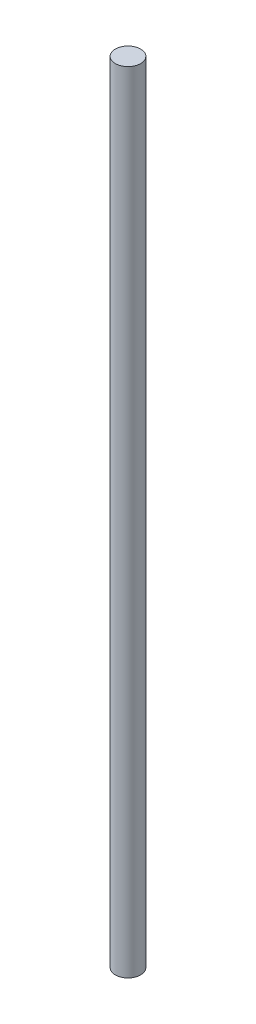
ISO-10303-21;
HEADER;
FILE_DESCRIPTION(('STEP AP214'),'2;1');
FILE_NAME('part.step','',(''),(''),'','','');
FILE_SCHEMA(('AUTOMOTIVE_DESIGN { 1 0 10303 214 1 1 1 1 }'));
ENDSEC;
DATA;
#1=APPLICATION_CONTEXT('core data for automotive mechanical design processes');
#2=APPLICATION_PROTOCOL_DEFINITION('international standard','automotive_design',2000,#1);
#3=PRODUCT_CONTEXT('',#1,'mechanical');
#4=PRODUCT('Part','Part','',(#3));
#5=PRODUCT_RELATED_PRODUCT_CATEGORY('part','',(#4));
#6=PRODUCT_DEFINITION_FORMATION('','',#4);
#7=PRODUCT_DEFINITION_CONTEXT('part definition',#1,'design');
#8=PRODUCT_DEFINITION('design','',#6,#7);
#9=PRODUCT_DEFINITION_SHAPE('','',#8);
#10=(LENGTH_UNIT() NAMED_UNIT(*) SI_UNIT(.MILLI.,.METRE.));
#11=(NAMED_UNIT(*) PLANE_ANGLE_UNIT() SI_UNIT($,.RADIAN.));
#12=(NAMED_UNIT(*) SI_UNIT($,.STERADIAN.) SOLID_ANGLE_UNIT());
#13=UNCERTAINTY_MEASURE_WITH_UNIT(LENGTH_MEASURE(1.E-05),#10,'distance_accuracy_value','');
#14=(GEOMETRIC_REPRESENTATION_CONTEXT(3) GLOBAL_UNCERTAINTY_ASSIGNED_CONTEXT((#13)) GLOBAL_UNIT_ASSIGNED_CONTEXT((#10,
#11,#12)) REPRESENTATION_CONTEXT('',''));
#15=CARTESIAN_POINT('',(0.,0.,0.));
#16=DIRECTION('',(0.,0.,1.));
#17=DIRECTION('',(1.,0.,0.));
#18=AXIS2_PLACEMENT_3D('',#15,#16,#17);
#19=CARTESIAN_POINT('',(0.,250.,0.));
#20=DIRECTION('',(0.,-1.,0.));
#21=DIRECTION('',(0.,0.,-1.));
#22=AXIS2_PLACEMENT_3D('',#19,#20,#21);
#23=CYLINDRICAL_SURFACE('',#22,4.);
#24=CARTESIAN_POINT('',(0.,250.,0.));
#25=DIRECTION('',(0.,1.,0.));
#26=DIRECTION('',(0.,0.,1.));
#27=AXIS2_PLACEMENT_3D('',#24,#25,#26);
#28=CIRCLE('',#27,4.);
#29=CARTESIAN_POINT('',(0.,250.,4.));
#30=VERTEX_POINT('',#29);
#31=EDGE_CURVE('E10',#30,#30,#28,.T.);
#32=ORIENTED_EDGE('',*,*,#31,.F.);
#33=EDGE_LOOP('',(#32));
#34=FACE_BOUND('',#33,.T.);
#35=CARTESIAN_POINT('',(0.,0.,0.));
#36=DIRECTION('',(0.,1.,0.));
#37=DIRECTION('',(0.,0.,1.));
#38=AXIS2_PLACEMENT_3D('',#35,#36,#37);
#39=CIRCLE('',#38,4.);
#40=CARTESIAN_POINT('',(0.,0.,4.));
#41=VERTEX_POINT('',#40);
#42=EDGE_CURVE('E33',#41,#41,#39,.T.);
#43=ORIENTED_EDGE('',*,*,#42,.T.);
#44=EDGE_LOOP('',(#43));
#45=FACE_BOUND('',#44,.T.);
#46=ADVANCED_FACE('F30',(#34,#45),#23,.T.);
#47=CARTESIAN_POINT('',(0.,250.,0.));
#48=DIRECTION('',(0.,1.,0.));
#49=DIRECTION('',(0.,0.,1.));
#50=AXIS2_PLACEMENT_3D('',#47,#48,#49);
#51=PLANE('',#50);
#52=ORIENTED_EDGE('',*,*,#31,.T.);
#53=EDGE_LOOP('',(#52));
#54=FACE_BOUND('',#53,.T.);
#55=ADVANCED_FACE('F45',(#54),#51,.T.);
#56=CARTESIAN_POINT('',(0.,0.,0.));
#57=DIRECTION('',(0.,1.,0.));
#58=DIRECTION('',(0.,0.,1.));
#59=AXIS2_PLACEMENT_3D('',#56,#57,#58);
#60=PLANE('',#59);
#61=ORIENTED_EDGE('',*,*,#42,.F.);
#62=EDGE_LOOP('',(#61));
#63=FACE_BOUND('',#62,.T.);
#64=ADVANCED_FACE('F43',(#63),#60,.F.);
#65=CLOSED_SHELL('',(#46,#55,#64));
#66=MANIFOLD_SOLID_BREP('B2',#65);
#67=ADVANCED_BREP_SHAPE_REPRESENTATION('',(#18,#66),#14);
#68=SHAPE_DEFINITION_REPRESENTATION(#9,#67);
ENDSEC;
END-ISO-10303-21;
